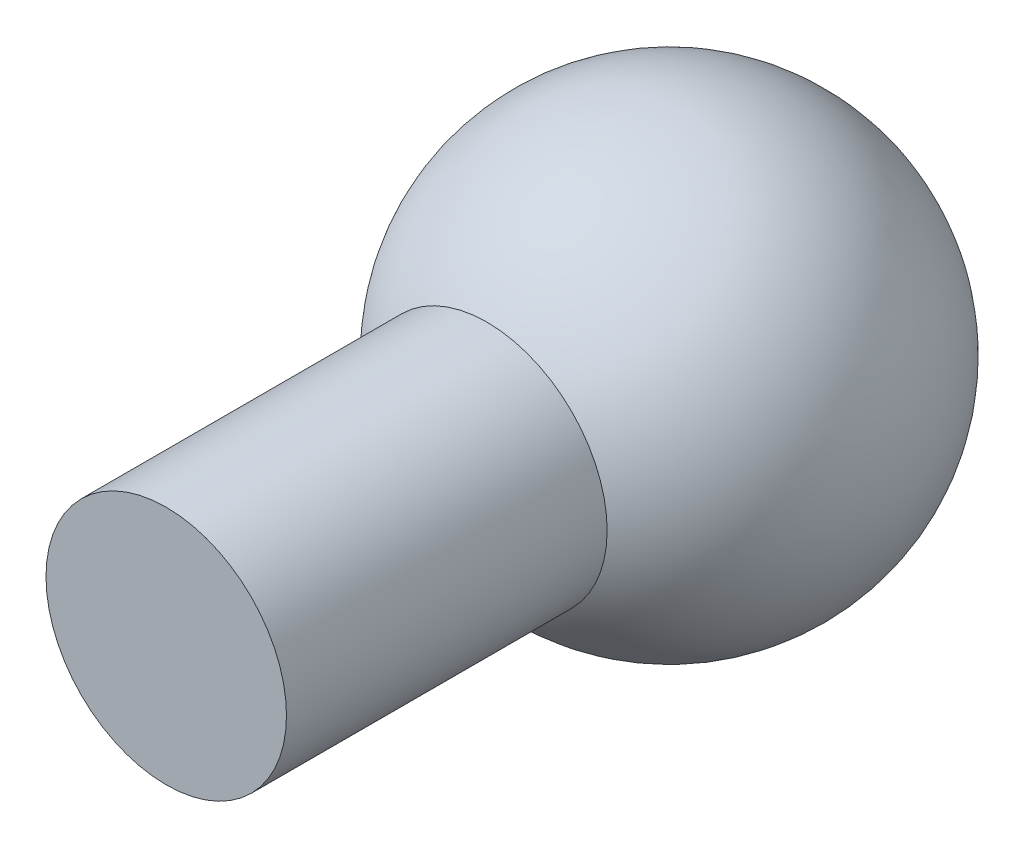
ISO-10303-21;
HEADER;
FILE_DESCRIPTION(('STEP AP214'),'2;1');
FILE_NAME('part.step','',(''),(''),'','','');
FILE_SCHEMA(('AUTOMOTIVE_DESIGN { 1 0 10303 214 1 1 1 1 }'));
ENDSEC;
DATA;
#1=APPLICATION_CONTEXT('core data for automotive mechanical design processes');
#2=APPLICATION_PROTOCOL_DEFINITION('international standard','automotive_design',2000,#1);
#3=PRODUCT_CONTEXT('',#1,'mechanical');
#4=PRODUCT('Part','Part','',(#3));
#5=PRODUCT_RELATED_PRODUCT_CATEGORY('part','',(#4));
#6=PRODUCT_DEFINITION_FORMATION('','',#4);
#7=PRODUCT_DEFINITION_CONTEXT('part definition',#1,'design');
#8=PRODUCT_DEFINITION('design','',#6,#7);
#9=PRODUCT_DEFINITION_SHAPE('','',#8);
#10=(LENGTH_UNIT() NAMED_UNIT(*) SI_UNIT(.MILLI.,.METRE.));
#11=(NAMED_UNIT(*) PLANE_ANGLE_UNIT() SI_UNIT($,.RADIAN.));
#12=(NAMED_UNIT(*) SI_UNIT($,.STERADIAN.) SOLID_ANGLE_UNIT());
#13=UNCERTAINTY_MEASURE_WITH_UNIT(LENGTH_MEASURE(1.E-05),#10,'distance_accuracy_value','');
#14=(GEOMETRIC_REPRESENTATION_CONTEXT(3) GLOBAL_UNCERTAINTY_ASSIGNED_CONTEXT((#13)) GLOBAL_UNIT_ASSIGNED_CONTEXT((#10,
#11,#12)) REPRESENTATION_CONTEXT('',''));
#15=CARTESIAN_POINT('',(0.,0.,0.));
#16=DIRECTION('',(0.,0.,1.));
#17=DIRECTION('',(1.,0.,0.));
#18=AXIS2_PLACEMENT_3D('',#15,#16,#17);
#19=CARTESIAN_POINT('',(0.,0.,4.));
#20=DIRECTION('',(0.,0.,-1.));
#21=DIRECTION('',(-1.,0.,0.));
#22=AXIS2_PLACEMENT_3D('',#19,#20,#21);
#23=CYLINDRICAL_SURFACE('',#22,1.5);
#24=CARTESIAN_POINT('',(0.,0.,4.));
#25=DIRECTION('',(0.,0.,1.));
#26=DIRECTION('',(1.,0.,0.));
#27=AXIS2_PLACEMENT_3D('',#24,#25,#26);
#28=CIRCLE('',#27,1.5);
#29=CARTESIAN_POINT('',(1.5,0.,4.));
#30=VERTEX_POINT('',#29);
#31=EDGE_CURVE('E10',#30,#30,#28,.T.);
#32=ORIENTED_EDGE('',*,*,#31,.F.);
#33=EDGE_LOOP('',(#32));
#34=FACE_BOUND('',#33,.T.);
#35=CARTESIAN_POINT('',(0.,0.,0.));
#36=DIRECTION('',(0.,0.,1.));
#37=DIRECTION('',(1.,0.,0.));
#38=AXIS2_PLACEMENT_3D('',#35,#36,#37);
#39=CIRCLE('',#38,1.5);
#40=CARTESIAN_POINT('',(1.5,0.,0.));
#41=VERTEX_POINT('',#40);
#42=EDGE_CURVE('E35',#41,#41,#39,.T.);
#43=ORIENTED_EDGE('',*,*,#42,.T.);
#44=EDGE_LOOP('',(#43));
#45=FACE_BOUND('',#44,.T.);
#46=ADVANCED_FACE('F31',(#34,#45),#23,.T.);
#47=CARTESIAN_POINT('',(0.,0.,4.));
#48=DIRECTION('',(0.,0.,1.));
#49=DIRECTION('',(1.,0.,0.));
#50=AXIS2_PLACEMENT_3D('',#47,#48,#49);
#51=PLANE('',#50);
#52=ORIENTED_EDGE('',*,*,#31,.T.);
#53=EDGE_LOOP('',(#52));
#54=FACE_BOUND('',#53,.T.);
#55=ADVANCED_FACE('F46',(#54),#51,.T.);
#56=CARTESIAN_POINT('',(0.,0.,-2.275));
#57=DIRECTION('',(0.,0.,1.));
#58=DIRECTION('',(1.,0.,0.));
#59=AXIS2_PLACEMENT_3D('',#56,#57,#58);
#60=SPHERICAL_SURFACE('',#59,2.725);
#61=ORIENTED_EDGE('',*,*,#42,.F.);
#62=EDGE_LOOP('',(#61));
#63=FACE_BOUND('',#62,.T.);
#64=ADVANCED_FACE('F33',(#63),#60,.T.);
#65=CLOSED_SHELL('',(#46,#55,#64));
#66=MANIFOLD_SOLID_BREP('B2',#65);
#67=ADVANCED_BREP_SHAPE_REPRESENTATION('',(#18,#66),#14);
#68=SHAPE_DEFINITION_REPRESENTATION(#9,#67);
ENDSEC;
END-ISO-10303-21;
